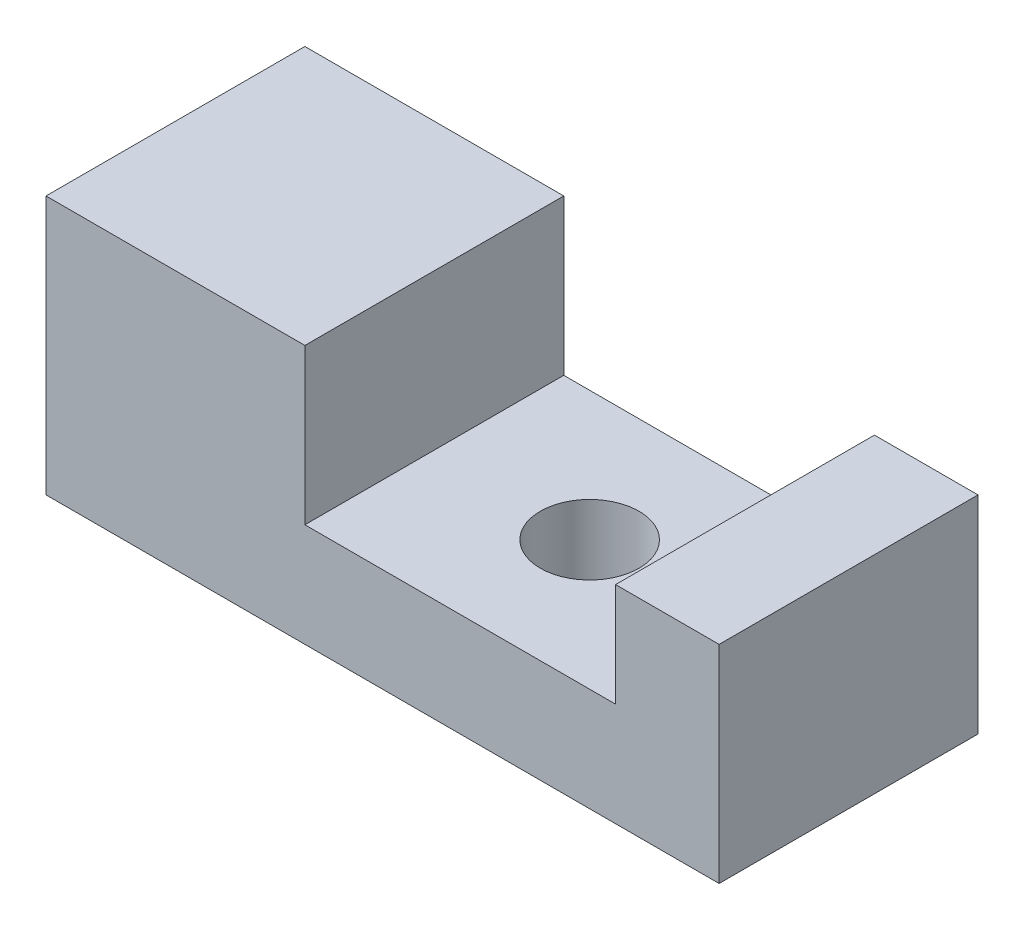
ISO-10303-21;
HEADER;
FILE_DESCRIPTION(('STEP AP214'),'2;1');
FILE_NAME('part.step','',(''),(''),'','','');
FILE_SCHEMA(('AUTOMOTIVE_DESIGN { 1 0 10303 214 1 1 1 1 }'));
ENDSEC;
DATA;
#1=APPLICATION_CONTEXT('core data for automotive mechanical design processes');
#2=APPLICATION_PROTOCOL_DEFINITION('international standard','automotive_design',2000,#1);
#3=PRODUCT_CONTEXT('',#1,'mechanical');
#4=PRODUCT('Part','Part','',(#3));
#5=PRODUCT_RELATED_PRODUCT_CATEGORY('part','',(#4));
#6=PRODUCT_DEFINITION_FORMATION('','',#4);
#7=PRODUCT_DEFINITION_CONTEXT('part definition',#1,'design');
#8=PRODUCT_DEFINITION('design','',#6,#7);
#9=PRODUCT_DEFINITION_SHAPE('','',#8);
#10=(LENGTH_UNIT() NAMED_UNIT(*) SI_UNIT(.MILLI.,.METRE.));
#11=(NAMED_UNIT(*) PLANE_ANGLE_UNIT() SI_UNIT($,.RADIAN.));
#12=(NAMED_UNIT(*) SI_UNIT($,.STERADIAN.) SOLID_ANGLE_UNIT());
#13=UNCERTAINTY_MEASURE_WITH_UNIT(LENGTH_MEASURE(1.E-05),#10,'distance_accuracy_value','');
#14=(GEOMETRIC_REPRESENTATION_CONTEXT(3) GLOBAL_UNCERTAINTY_ASSIGNED_CONTEXT((#13)) GLOBAL_UNIT_ASSIGNED_CONTEXT((#10,
#11,#12)) REPRESENTATION_CONTEXT('',''));
#15=CARTESIAN_POINT('',(0.,0.,0.));
#16=DIRECTION('',(0.,0.,1.));
#17=DIRECTION('',(1.,0.,0.));
#18=AXIS2_PLACEMENT_3D('',#15,#16,#17);
#19=CARTESIAN_POINT('',(130.,0.,25.));
#20=DIRECTION('',(0.,1.,0.));
#21=DIRECTION('',(-1.,0.,0.));
#22=AXIS2_PLACEMENT_3D('',#19,#20,#21);
#23=PLANE('',#22);
#24=CARTESIAN_POINT('',(80.,0.,0.));
#25=DIRECTION('',(0.,1.,0.));
#26=DIRECTION('',(0.,0.,1.));
#27=AXIS2_PLACEMENT_3D('',#24,#25,#26);
#28=CIRCLE('',#27,9.53699000334986);
#29=CARTESIAN_POINT('',(80.,0.,9.53699000334986));
#30=VERTEX_POINT('',#29);
#31=EDGE_CURVE('E145',#30,#30,#28,.T.);
#32=ORIENTED_EDGE('',*,*,#31,.T.);
#33=EDGE_LOOP('',(#32));
#34=FACE_BOUND('',#33,.T.);
#35=DIRECTION('',(1.,0.,0.));
#36=VECTOR('',#35,1.);
#37=CARTESIAN_POINT('',(130.,0.,-25.));
#38=LINE('',#37,#36);
#39=CARTESIAN_POINT('',(0.,0.,-25.));
#40=VERTEX_POINT('',#39);
#41=CARTESIAN_POINT('',(130.,0.,-25.));
#42=VERTEX_POINT('',#41);
#43=EDGE_CURVE('E140',#40,#42,#38,.T.);
#44=ORIENTED_EDGE('',*,*,#43,.T.);
#45=DIRECTION('',(0.,0.,-1.));
#46=VECTOR('',#45,1.);
#47=CARTESIAN_POINT('',(130.,0.,25.));
#48=LINE('',#47,#46);
#49=CARTESIAN_POINT('',(130.,0.,25.));
#50=VERTEX_POINT('',#49);
#51=EDGE_CURVE('E11',#50,#42,#48,.T.);
#52=ORIENTED_EDGE('',*,*,#51,.F.);
#53=DIRECTION('',(1.,0.,0.));
#54=VECTOR('',#53,1.);
#55=CARTESIAN_POINT('',(130.,0.,25.));
#56=LINE('',#55,#54);
#57=CARTESIAN_POINT('',(0.,0.,25.));
#58=VERTEX_POINT('',#57);
#59=EDGE_CURVE('E163',#58,#50,#56,.T.);
#60=ORIENTED_EDGE('',*,*,#59,.F.);
#61=DIRECTION('',(0.,0.,-1.));
#62=VECTOR('',#61,1.);
#63=CARTESIAN_POINT('',(0.,0.,25.));
#64=LINE('',#63,#62);
#65=EDGE_CURVE('E136',#58,#40,#64,.T.);
#66=ORIENTED_EDGE('',*,*,#65,.T.);
#67=EDGE_LOOP('',(#44,#52,#60,#66));
#68=FACE_BOUND('',#67,.T.);
#69=ADVANCED_FACE('F39',(#34,#68),#23,.F.);
#70=CARTESIAN_POINT('',(130.,40.,25.));
#71=DIRECTION('',(-1.,0.,0.));
#72=DIRECTION('',(0.,0.,1.));
#73=AXIS2_PLACEMENT_3D('',#70,#71,#72);
#74=PLANE('',#73);
#75=DIRECTION('',(0.,1.,0.));
#76=VECTOR('',#75,1.);
#77=CARTESIAN_POINT('',(130.,40.,-25.));
#78=LINE('',#77,#76);
#79=CARTESIAN_POINT('',(130.,40.,-25.));
#80=VERTEX_POINT('',#79);
#81=EDGE_CURVE('E144',#42,#80,#78,.T.);
#82=ORIENTED_EDGE('',*,*,#81,.T.);
#83=DIRECTION('',(0.,0.,-1.));
#84=VECTOR('',#83,1.);
#85=CARTESIAN_POINT('',(130.,40.,25.));
#86=LINE('',#85,#84);
#87=CARTESIAN_POINT('',(130.,40.,25.));
#88=VERTEX_POINT('',#87);
#89=EDGE_CURVE('E48',#88,#80,#86,.T.);
#90=ORIENTED_EDGE('',*,*,#89,.F.);
#91=DIRECTION('',(0.,1.,0.));
#92=VECTOR('',#91,1.);
#93=CARTESIAN_POINT('',(130.,40.,25.));
#94=LINE('',#93,#92);
#95=EDGE_CURVE('E99',#50,#88,#94,.T.);
#96=ORIENTED_EDGE('',*,*,#95,.F.);
#97=ORIENTED_EDGE('',*,*,#51,.T.);
#98=EDGE_LOOP('',(#82,#90,#96,#97));
#99=FACE_BOUND('',#98,.T.);
#100=ADVANCED_FACE('F232',(#99),#74,.F.);
#101=CARTESIAN_POINT('',(110.,40.,25.));
#102=DIRECTION('',(0.,-1.,0.));
#103=DIRECTION('',(0.,0.,-1.));
#104=AXIS2_PLACEMENT_3D('',#101,#102,#103);
#105=PLANE('',#104);
#106=DIRECTION('',(-1.,0.,0.));
#107=VECTOR('',#106,1.);
#108=CARTESIAN_POINT('',(110.,40.,-25.));
#109=LINE('',#108,#107);
#110=CARTESIAN_POINT('',(110.,40.,-25.));
#111=VERTEX_POINT('',#110);
#112=EDGE_CURVE('E148',#80,#111,#109,.T.);
#113=ORIENTED_EDGE('',*,*,#112,.T.);
#114=DIRECTION('',(0.,0.,-1.));
#115=VECTOR('',#114,1.);
#116=CARTESIAN_POINT('',(110.,40.,25.));
#117=LINE('',#116,#115);
#118=CARTESIAN_POINT('',(110.,40.,25.));
#119=VERTEX_POINT('',#118);
#120=EDGE_CURVE('E174',#119,#111,#117,.T.);
#121=ORIENTED_EDGE('',*,*,#120,.F.);
#122=DIRECTION('',(-1.,0.,0.));
#123=VECTOR('',#122,1.);
#124=CARTESIAN_POINT('',(110.,40.,25.));
#125=LINE('',#124,#123);
#126=EDGE_CURVE('E184',#88,#119,#125,.T.);
#127=ORIENTED_EDGE('',*,*,#126,.F.);
#128=ORIENTED_EDGE('',*,*,#89,.T.);
#129=EDGE_LOOP('',(#113,#121,#127,#128));
#130=FACE_BOUND('',#129,.T.);
#131=ADVANCED_FACE('F182',(#130),#105,.F.);
#132=CARTESIAN_POINT('',(110.,20.,25.));
#133=DIRECTION('',(1.,0.,0.));
#134=DIRECTION('',(0.,0.,-1.));
#135=AXIS2_PLACEMENT_3D('',#132,#133,#134);
#136=PLANE('',#135);
#137=DIRECTION('',(0.,-1.,0.));
#138=VECTOR('',#137,1.);
#139=CARTESIAN_POINT('',(110.,20.,-25.));
#140=LINE('',#139,#138);
#141=CARTESIAN_POINT('',(110.,20.,-25.));
#142=VERTEX_POINT('',#141);
#143=EDGE_CURVE('E151',#111,#142,#140,.T.);
#144=ORIENTED_EDGE('',*,*,#143,.T.);
#145=DIRECTION('',(0.,0.,-1.));
#146=VECTOR('',#145,1.);
#147=CARTESIAN_POINT('',(110.,20.,25.));
#148=LINE('',#147,#146);
#149=CARTESIAN_POINT('',(110.,20.,25.));
#150=VERTEX_POINT('',#149);
#151=EDGE_CURVE('E170',#150,#142,#148,.T.);
#152=ORIENTED_EDGE('',*,*,#151,.F.);
#153=DIRECTION('',(0.,-1.,0.));
#154=VECTOR('',#153,1.);
#155=CARTESIAN_POINT('',(110.,20.,25.));
#156=LINE('',#155,#154);
#157=EDGE_CURVE('E197',#119,#150,#156,.T.);
#158=ORIENTED_EDGE('',*,*,#157,.F.);
#159=ORIENTED_EDGE('',*,*,#120,.T.);
#160=EDGE_LOOP('',(#144,#152,#158,#159));
#161=FACE_BOUND('',#160,.T.);
#162=ADVANCED_FACE('F192',(#161),#136,.F.);
#163=CARTESIAN_POINT('',(50.,20.,25.));
#164=DIRECTION('',(0.,-1.,0.));
#165=DIRECTION('',(0.,0.,-1.));
#166=AXIS2_PLACEMENT_3D('',#163,#164,#165);
#167=PLANE('',#166);
#168=CARTESIAN_POINT('',(80.,20.,0.));
#169=DIRECTION('',(0.,1.,0.));
#170=DIRECTION('',(0.,0.,1.));
#171=AXIS2_PLACEMENT_3D('',#168,#169,#170);
#172=CIRCLE('',#171,9.53699000334986);
#173=CARTESIAN_POINT('',(80.,20.,9.53699000334986));
#174=VERTEX_POINT('',#173);
#175=EDGE_CURVE('E207',#174,#174,#172,.T.);
#176=ORIENTED_EDGE('',*,*,#175,.F.);
#177=EDGE_LOOP('',(#176));
#178=FACE_BOUND('',#177,.T.);
#179=DIRECTION('',(-1.,0.,0.));
#180=VECTOR('',#179,1.);
#181=CARTESIAN_POINT('',(50.,20.,-25.));
#182=LINE('',#181,#180);
#183=CARTESIAN_POINT('',(50.,20.,-25.));
#184=VERTEX_POINT('',#183);
#185=EDGE_CURVE('E154',#142,#184,#182,.T.);
#186=ORIENTED_EDGE('',*,*,#185,.T.);
#187=DIRECTION('',(0.,0.,-1.));
#188=VECTOR('',#187,1.);
#189=CARTESIAN_POINT('',(50.,20.,25.));
#190=LINE('',#189,#188);
#191=CARTESIAN_POINT('',(50.,20.,25.));
#192=VERTEX_POINT('',#191);
#193=EDGE_CURVE('E129',#192,#184,#190,.T.);
#194=ORIENTED_EDGE('',*,*,#193,.F.);
#195=DIRECTION('',(-1.,0.,0.));
#196=VECTOR('',#195,1.);
#197=CARTESIAN_POINT('',(50.,20.,25.));
#198=LINE('',#197,#196);
#199=EDGE_CURVE('E118',#150,#192,#198,.T.);
#200=ORIENTED_EDGE('',*,*,#199,.F.);
#201=ORIENTED_EDGE('',*,*,#151,.T.);
#202=EDGE_LOOP('',(#186,#194,#200,#201));
#203=FACE_BOUND('',#202,.T.);
#204=ADVANCED_FACE('F195',(#178,#203),#167,.F.);
#205=CARTESIAN_POINT('',(50.,50.,25.));
#206=DIRECTION('',(-1.,0.,0.));
#207=DIRECTION('',(0.,-1.,0.));
#208=AXIS2_PLACEMENT_3D('',#205,#206,#207);
#209=PLANE('',#208);
#210=DIRECTION('',(0.,1.,0.));
#211=VECTOR('',#210,1.);
#212=CARTESIAN_POINT('',(50.,50.,-25.));
#213=LINE('',#212,#211);
#214=CARTESIAN_POINT('',(50.,50.,-25.));
#215=VERTEX_POINT('',#214);
#216=EDGE_CURVE('E127',#184,#215,#213,.T.);
#217=ORIENTED_EDGE('',*,*,#216,.T.);
#218=DIRECTION('',(0.,0.,-1.));
#219=VECTOR('',#218,1.);
#220=CARTESIAN_POINT('',(50.,50.,25.));
#221=LINE('',#220,#219);
#222=CARTESIAN_POINT('',(50.,50.,25.));
#223=VERTEX_POINT('',#222);
#224=EDGE_CURVE('E124',#223,#215,#221,.T.);
#225=ORIENTED_EDGE('',*,*,#224,.F.);
#226=DIRECTION('',(0.,1.,0.));
#227=VECTOR('',#226,1.);
#228=CARTESIAN_POINT('',(50.,50.,25.));
#229=LINE('',#228,#227);
#230=EDGE_CURVE('E112',#192,#223,#229,.T.);
#231=ORIENTED_EDGE('',*,*,#230,.F.);
#232=ORIENTED_EDGE('',*,*,#193,.T.);
#233=EDGE_LOOP('',(#217,#225,#231,#232));
#234=FACE_BOUND('',#233,.T.);
#235=ADVANCED_FACE('F125',(#234),#209,.F.);
#236=CARTESIAN_POINT('',(0.,50.,25.));
#237=DIRECTION('',(0.,-1.,0.));
#238=DIRECTION('',(0.,0.,-1.));
#239=AXIS2_PLACEMENT_3D('',#236,#237,#238);
#240=PLANE('',#239);
#241=DIRECTION('',(-1.,0.,0.));
#242=VECTOR('',#241,1.);
#243=CARTESIAN_POINT('',(0.,50.,-25.));
#244=LINE('',#243,#242);
#245=CARTESIAN_POINT('',(0.,50.,-25.));
#246=VERTEX_POINT('',#245);
#247=EDGE_CURVE('E85',#215,#246,#244,.T.);
#248=ORIENTED_EDGE('',*,*,#247,.T.);
#249=DIRECTION('',(0.,0.,-1.));
#250=VECTOR('',#249,1.);
#251=CARTESIAN_POINT('',(0.,50.,25.));
#252=LINE('',#251,#250);
#253=CARTESIAN_POINT('',(0.,50.,25.));
#254=VERTEX_POINT('',#253);
#255=EDGE_CURVE('E130',#254,#246,#252,.T.);
#256=ORIENTED_EDGE('',*,*,#255,.F.);
#257=DIRECTION('',(-1.,0.,0.));
#258=VECTOR('',#257,1.);
#259=CARTESIAN_POINT('',(0.,50.,25.));
#260=LINE('',#259,#258);
#261=EDGE_CURVE('E116',#223,#254,#260,.T.);
#262=ORIENTED_EDGE('',*,*,#261,.F.);
#263=ORIENTED_EDGE('',*,*,#224,.T.);
#264=EDGE_LOOP('',(#248,#256,#262,#263));
#265=FACE_BOUND('',#264,.T.);
#266=ADVANCED_FACE('F132',(#265),#240,.F.);
#267=CARTESIAN_POINT('',(0.,0.,25.));
#268=DIRECTION('',(1.,0.,0.));
#269=DIRECTION('',(0.,0.,-1.));
#270=AXIS2_PLACEMENT_3D('',#267,#268,#269);
#271=PLANE('',#270);
#272=DIRECTION('',(0.,-1.,0.));
#273=VECTOR('',#272,1.);
#274=CARTESIAN_POINT('',(0.,0.,-25.));
#275=LINE('',#274,#273);
#276=EDGE_CURVE('E91',#246,#40,#275,.T.);
#277=ORIENTED_EDGE('',*,*,#276,.T.);
#278=ORIENTED_EDGE('',*,*,#65,.F.);
#279=DIRECTION('',(0.,-1.,0.));
#280=VECTOR('',#279,1.);
#281=CARTESIAN_POINT('',(0.,0.,25.));
#282=LINE('',#281,#280);
#283=EDGE_CURVE('E56',#254,#58,#282,.T.);
#284=ORIENTED_EDGE('',*,*,#283,.F.);
#285=ORIENTED_EDGE('',*,*,#255,.T.);
#286=EDGE_LOOP('',(#277,#278,#284,#285));
#287=FACE_BOUND('',#286,.T.);
#288=ADVANCED_FACE('F242',(#287),#271,.F.);
#289=CARTESIAN_POINT('',(0.,0.,25.));
#290=DIRECTION('',(0.,0.,-1.));
#291=DIRECTION('',(-1.,0.,0.));
#292=AXIS2_PLACEMENT_3D('',#289,#290,#291);
#293=PLANE('',#292);
#294=ORIENTED_EDGE('',*,*,#59,.T.);
#295=ORIENTED_EDGE('',*,*,#95,.T.);
#296=ORIENTED_EDGE('',*,*,#126,.T.);
#297=ORIENTED_EDGE('',*,*,#157,.T.);
#298=ORIENTED_EDGE('',*,*,#199,.T.);
#299=ORIENTED_EDGE('',*,*,#230,.T.);
#300=ORIENTED_EDGE('',*,*,#261,.T.);
#301=ORIENTED_EDGE('',*,*,#283,.T.);
#302=EDGE_LOOP('',(#294,#295,#296,#297,#298,#299,#300,#301));
#303=FACE_BOUND('',#302,.T.);
#304=ADVANCED_FACE('F114',(#303),#293,.F.);
#305=CARTESIAN_POINT('',(0.,0.,-25.));
#306=DIRECTION('',(0.,0.,-1.));
#307=DIRECTION('',(-1.,0.,0.));
#308=AXIS2_PLACEMENT_3D('',#305,#306,#307);
#309=PLANE('',#308);
#310=ORIENTED_EDGE('',*,*,#43,.F.);
#311=ORIENTED_EDGE('',*,*,#276,.F.);
#312=ORIENTED_EDGE('',*,*,#247,.F.);
#313=ORIENTED_EDGE('',*,*,#216,.F.);
#314=ORIENTED_EDGE('',*,*,#185,.F.);
#315=ORIENTED_EDGE('',*,*,#143,.F.);
#316=ORIENTED_EDGE('',*,*,#112,.F.);
#317=ORIENTED_EDGE('',*,*,#81,.F.);
#318=EDGE_LOOP('',(#310,#311,#312,#313,#314,#315,#316,#317));
#319=FACE_BOUND('',#318,.T.);
#320=ADVANCED_FACE('F188',(#319),#309,.T.);
#321=CARTESIAN_POINT('',(80.,0.,0.));
#322=DIRECTION('',(0.,1.,0.));
#323=DIRECTION('',(0.,0.,1.));
#324=AXIS2_PLACEMENT_3D('',#321,#322,#323);
#325=CYLINDRICAL_SURFACE('',#324,9.53699000334986);
#326=ORIENTED_EDGE('',*,*,#31,.F.);
#327=EDGE_LOOP('',(#326));
#328=FACE_BOUND('',#327,.T.);
#329=ORIENTED_EDGE('',*,*,#175,.T.);
#330=EDGE_LOOP('',(#329));
#331=FACE_BOUND('',#330,.T.);
#332=ADVANCED_FACE('F217',(#328,#331),#325,.F.);
#333=CLOSED_SHELL('',(#69,#100,#131,#162,#204,#235,#266,#288,#304,#320,#332));
#334=MANIFOLD_SOLID_BREP('B2',#333);
#335=ADVANCED_BREP_SHAPE_REPRESENTATION('',(#18,#334),#14);
#336=SHAPE_DEFINITION_REPRESENTATION(#9,#335);
ENDSEC;
END-ISO-10303-21;
